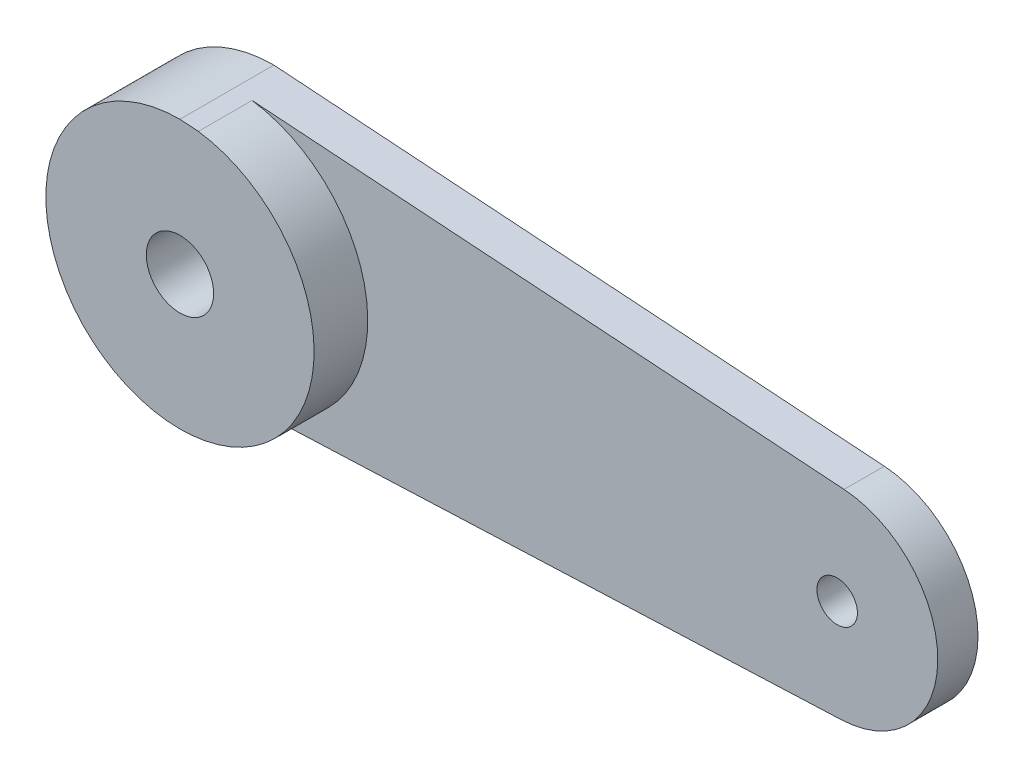
ISO-10303-21;
HEADER;
FILE_DESCRIPTION(('STEP AP214'),'2;1');
FILE_NAME('part.step','',(''),(''),'','','');
FILE_SCHEMA(('AUTOMOTIVE_DESIGN { 1 0 10303 214 1 1 1 1 }'));
ENDSEC;
DATA;
#1=APPLICATION_CONTEXT('core data for automotive mechanical design processes');
#2=APPLICATION_PROTOCOL_DEFINITION('international standard','automotive_design',2000,#1);
#3=PRODUCT_CONTEXT('',#1,'mechanical');
#4=PRODUCT('Part','Part','',(#3));
#5=PRODUCT_RELATED_PRODUCT_CATEGORY('part','',(#4));
#6=PRODUCT_DEFINITION_FORMATION('','',#4);
#7=PRODUCT_DEFINITION_CONTEXT('part definition',#1,'design');
#8=PRODUCT_DEFINITION('design','',#6,#7);
#9=PRODUCT_DEFINITION_SHAPE('','',#8);
#10=(LENGTH_UNIT() NAMED_UNIT(*) SI_UNIT(.MILLI.,.METRE.));
#11=(NAMED_UNIT(*) PLANE_ANGLE_UNIT() SI_UNIT($,.RADIAN.));
#12=(NAMED_UNIT(*) SI_UNIT($,.STERADIAN.) SOLID_ANGLE_UNIT());
#13=UNCERTAINTY_MEASURE_WITH_UNIT(LENGTH_MEASURE(1.E-05),#10,'distance_accuracy_value','');
#14=(GEOMETRIC_REPRESENTATION_CONTEXT(3) GLOBAL_UNCERTAINTY_ASSIGNED_CONTEXT((#13)) GLOBAL_UNIT_ASSIGNED_CONTEXT((#10,
#11,#12)) REPRESENTATION_CONTEXT('',''));
#15=CARTESIAN_POINT('',(0.,0.,0.));
#16=DIRECTION('',(0.,0.,1.));
#17=DIRECTION('',(1.,0.,0.));
#18=AXIS2_PLACEMENT_3D('',#15,#16,#17);
#19=CARTESIAN_POINT('',(0.686952853013244,9.95258475724918,7.));
#20=DIRECTION('',(0.0688587269348014,0.997626420923643,0.));
#21=DIRECTION('',(-0.997626420923644,0.0688587269348014,0.));
#22=AXIS2_PLACEMENT_3D('',#19,#20,#21);
#23=PLANE('',#22);
#24=DIRECTION('',(0.997626420923644,-0.0688587269348014,0.));
#25=VECTOR('',#24,1.);
#26=CARTESIAN_POINT('',(0.686952853013244,9.95258475724918,0.));
#27=LINE('',#26,#25);
#28=CARTESIAN_POINT('',(0.,10.,0.));
#29=VERTEX_POINT('',#28);
#30=CARTESIAN_POINT('',(45.5121199289753,6.85863708830833,0.));
#31=VERTEX_POINT('',#30);
#32=EDGE_CURVE('E115',#29,#31,#27,.T.);
#33=ORIENTED_EDGE('',*,*,#32,.F.);
#34=DIRECTION('',(0.,0.,-1.));
#35=VECTOR('',#34,1.);
#36=CARTESIAN_POINT('',(0.,10.,7.));
#37=LINE('',#36,#35);
#38=CARTESIAN_POINT('',(0.,10.,7.));
#39=VERTEX_POINT('',#38);
#40=EDGE_CURVE('E11',#39,#29,#37,.T.);
#41=ORIENTED_EDGE('',*,*,#40,.F.);
#42=DIRECTION('',(0.997626420923644,-0.0688587269348014,0.));
#43=VECTOR('',#42,1.);
#44=CARTESIAN_POINT('',(0.686952853013244,9.95258475724918,7.));
#45=LINE('',#44,#43);
#46=CARTESIAN_POINT('',(1.37390570602649,9.90516951449837,7.));
#47=VERTEX_POINT('',#46);
#48=EDGE_CURVE('E124',#39,#47,#45,.T.);
#49=ORIENTED_EDGE('',*,*,#48,.T.);
#50=DIRECTION('',(0.,0.,-1.));
#51=VECTOR('',#50,1.);
#52=CARTESIAN_POINT('',(1.37390570602649,9.90516951449837,7.));
#53=LINE('',#52,#51);
#54=CARTESIAN_POINT('',(1.37390570602649,9.90516951449837,3.));
#55=VERTEX_POINT('',#54);
#56=EDGE_CURVE('E139',#47,#55,#53,.T.);
#57=ORIENTED_EDGE('',*,*,#56,.T.);
#58=DIRECTION('',(0.997626420923644,-0.0688587269348014,0.));
#59=VECTOR('',#58,1.);
#60=CARTESIAN_POINT('',(0.686952853013244,9.95258475724918,3.));
#61=LINE('',#60,#59);
#62=CARTESIAN_POINT('',(45.5121199289753,6.85863708830833,3.));
#63=VERTEX_POINT('',#62);
#64=EDGE_CURVE('E100',#55,#63,#61,.T.);
#65=ORIENTED_EDGE('',*,*,#64,.T.);
#66=DIRECTION('',(0.,0.,-1.));
#67=VECTOR('',#66,1.);
#68=CARTESIAN_POINT('',(45.5121199289753,6.85863708830833,3.));
#69=LINE('',#68,#67);
#70=EDGE_CURVE('E96',#63,#31,#69,.T.);
#71=ORIENTED_EDGE('',*,*,#70,.T.);
#72=EDGE_LOOP('',(#33,#41,#49,#57,#65,#71));
#73=FACE_BOUND('',#72,.T.);
#74=ADVANCED_FACE('F37',(#73),#23,.T.);
#75=CARTESIAN_POINT('',(0.,0.,7.));
#76=DIRECTION('',(0.,0.,-1.));
#77=DIRECTION('',(-1.,0.,0.));
#78=AXIS2_PLACEMENT_3D('',#75,#76,#77);
#79=CYLINDRICAL_SURFACE('',#78,10.);
#80=CARTESIAN_POINT('',(0.,0.,0.));
#81=DIRECTION('',(0.,0.,1.));
#82=DIRECTION('',(1.,0.,0.));
#83=AXIS2_PLACEMENT_3D('',#80,#81,#82);
#84=CIRCLE('',#83,10.);
#85=CARTESIAN_POINT('',(0.,-10.,0.));
#86=VERTEX_POINT('',#85);
#87=EDGE_CURVE('E135',#29,#86,#84,.T.);
#88=ORIENTED_EDGE('',*,*,#87,.T.);
#89=DIRECTION('',(0.,0.,-1.));
#90=VECTOR('',#89,1.);
#91=CARTESIAN_POINT('',(0.,-10.,7.));
#92=LINE('',#91,#90);
#93=CARTESIAN_POINT('',(0.,-10.,7.));
#94=VERTEX_POINT('',#93);
#95=EDGE_CURVE('E45',#94,#86,#92,.T.);
#96=ORIENTED_EDGE('',*,*,#95,.F.);
#97=CARTESIAN_POINT('',(0.,0.,7.));
#98=DIRECTION('',(0.,0.,1.));
#99=DIRECTION('',(1.,0.,0.));
#100=AXIS2_PLACEMENT_3D('',#97,#98,#99);
#101=CIRCLE('',#100,10.);
#102=EDGE_CURVE('E127',#39,#94,#101,.T.);
#103=ORIENTED_EDGE('',*,*,#102,.F.);
#104=ORIENTED_EDGE('',*,*,#40,.T.);
#105=EDGE_LOOP('',(#88,#96,#103,#104));
#106=FACE_BOUND('',#105,.T.);
#107=ADVANCED_FACE('F145',(#106),#79,.T.);
#108=CARTESIAN_POINT('',(0.414871138524848,-9.98275846679519,7.));
#109=DIRECTION('',(-0.041522925239939,0.999137551430992,0.));
#110=DIRECTION('',(-0.999137551430992,-0.041522925239939,0.));
#111=AXIS2_PLACEMENT_3D('',#108,#109,#110);
#112=PLANE('',#111);
#113=DIRECTION('',(0.999137551430992,0.041522925239939,0.));
#114=VECTOR('',#113,1.);
#115=CARTESIAN_POINT('',(0.414871138524848,-9.98275846679519,0.));
#116=LINE('',#115,#114);
#117=CARTESIAN_POINT('',(45.3071014162638,-8.11709270435144,0.));
#118=VERTEX_POINT('',#117);
#119=EDGE_CURVE('E110',#86,#118,#116,.T.);
#120=ORIENTED_EDGE('',*,*,#119,.T.);
#121=DIRECTION('',(0.,0.,-1.));
#122=VECTOR('',#121,1.);
#123=CARTESIAN_POINT('',(45.3071014162638,-8.11709270435144,3.));
#124=LINE('',#123,#122);
#125=CARTESIAN_POINT('',(45.3071014162638,-8.11709270435144,3.));
#126=VERTEX_POINT('',#125);
#127=EDGE_CURVE('E94',#126,#118,#124,.T.);
#128=ORIENTED_EDGE('',*,*,#127,.F.);
#129=DIRECTION('',(0.999137551430992,0.041522925239939,0.));
#130=VECTOR('',#129,1.);
#131=CARTESIAN_POINT('',(0.414871138524848,-9.98275846679519,3.));
#132=LINE('',#131,#130);
#133=CARTESIAN_POINT('',(0.829742277049664,-9.96551693359037,3.));
#134=VERTEX_POINT('',#133);
#135=EDGE_CURVE('E101',#134,#126,#132,.T.);
#136=ORIENTED_EDGE('',*,*,#135,.F.);
#137=DIRECTION('',(0.,0.,-1.));
#138=VECTOR('',#137,1.);
#139=CARTESIAN_POINT('',(0.829742277049664,-9.96551693359037,7.));
#140=LINE('',#139,#138);
#141=CARTESIAN_POINT('',(0.829742277049664,-9.96551693359037,7.));
#142=VERTEX_POINT('',#141);
#143=EDGE_CURVE('E52',#142,#134,#140,.T.);
#144=ORIENTED_EDGE('',*,*,#143,.F.);
#145=DIRECTION('',(0.999137551430992,0.041522925239939,0.));
#146=VECTOR('',#145,1.);
#147=CARTESIAN_POINT('',(0.414871138524848,-9.98275846679519,7.));
#148=LINE('',#147,#146);
#149=EDGE_CURVE('E130',#94,#142,#148,.T.);
#150=ORIENTED_EDGE('',*,*,#149,.F.);
#151=ORIENTED_EDGE('',*,*,#95,.T.);
#152=EDGE_LOOP('',(#120,#128,#136,#144,#150,#151));
#153=FACE_BOUND('',#152,.T.);
#154=ADVANCED_FACE('F108',(#153),#112,.F.);
#155=CARTESIAN_POINT('',(0.,0.,7.));
#156=DIRECTION('',(0.,0.,-1.));
#157=DIRECTION('',(-1.,0.,0.));
#158=AXIS2_PLACEMENT_3D('',#155,#156,#157);
#159=CYLINDRICAL_SURFACE('',#158,2.51);
#160=CARTESIAN_POINT('',(0.,0.,7.));
#161=DIRECTION('',(0.,0.,1.));
#162=DIRECTION('',(1.,0.,0.));
#163=AXIS2_PLACEMENT_3D('',#160,#161,#162);
#164=CIRCLE('',#163,2.51);
#165=CARTESIAN_POINT('',(2.51,0.,7.));
#166=VERTEX_POINT('',#165);
#167=EDGE_CURVE('E121',#166,#166,#164,.T.);
#168=ORIENTED_EDGE('',*,*,#167,.T.);
#169=EDGE_LOOP('',(#168));
#170=FACE_BOUND('',#169,.T.);
#171=CARTESIAN_POINT('',(0.,0.,0.));
#172=DIRECTION('',(0.,0.,1.));
#173=DIRECTION('',(1.,0.,0.));
#174=AXIS2_PLACEMENT_3D('',#171,#172,#173);
#175=CIRCLE('',#174,2.51);
#176=CARTESIAN_POINT('',(2.51,0.,0.));
#177=VERTEX_POINT('',#176);
#178=EDGE_CURVE('E112',#177,#177,#175,.T.);
#179=ORIENTED_EDGE('',*,*,#178,.F.);
#180=EDGE_LOOP('',(#179));
#181=FACE_BOUND('',#180,.T.);
#182=ADVANCED_FACE('F39',(#170,#181),#159,.F.);
#183=ORIENTED_EDGE('',*,*,#143,.T.);
#184=CARTESIAN_POINT('',(0.,0.,3.));
#185=DIRECTION('',(0.,0.,1.));
#186=DIRECTION('',(1.,0.,0.));
#187=AXIS2_PLACEMENT_3D('',#184,#185,#186);
#188=CIRCLE('',#187,10.);
#189=EDGE_CURVE('E57',#134,#55,#188,.T.);
#190=ORIENTED_EDGE('',*,*,#189,.T.);
#191=ORIENTED_EDGE('',*,*,#56,.F.);
#192=EDGE_CURVE('E131',#142,#47,#101,.T.);
#193=ORIENTED_EDGE('',*,*,#192,.F.);
#194=EDGE_LOOP('',(#183,#190,#191,#193));
#195=FACE_BOUND('',#194,.T.);
#196=ADVANCED_FACE('F173',(#195),#79,.T.);
#197=CARTESIAN_POINT('',(0.,0.,7.));
#198=DIRECTION('',(0.,0.,1.));
#199=DIRECTION('',(1.,0.,0.));
#200=AXIS2_PLACEMENT_3D('',#197,#198,#199);
#201=PLANE('',#200);
#202=ORIENTED_EDGE('',*,*,#167,.F.);
#203=EDGE_LOOP('',(#202));
#204=FACE_BOUND('',#203,.T.);
#205=ORIENTED_EDGE('',*,*,#48,.F.);
#206=ORIENTED_EDGE('',*,*,#102,.T.);
#207=ORIENTED_EDGE('',*,*,#149,.T.);
#208=ORIENTED_EDGE('',*,*,#192,.T.);
#209=EDGE_LOOP('',(#205,#206,#207,#208));
#210=FACE_BOUND('',#209,.T.);
#211=ADVANCED_FACE('F178',(#204,#210),#201,.T.);
#212=CARTESIAN_POINT('',(0.,0.,0.));
#213=DIRECTION('',(0.,0.,1.));
#214=DIRECTION('',(1.,0.,0.));
#215=AXIS2_PLACEMENT_3D('',#212,#213,#214);
#216=PLANE('',#215);
#217=ORIENTED_EDGE('',*,*,#178,.T.);
#218=EDGE_LOOP('',(#217));
#219=FACE_BOUND('',#218,.T.);
#220=ORIENTED_EDGE('',*,*,#32,.T.);
#221=CARTESIAN_POINT('',(44.9956794769643,-0.623561068618998,0.));
#222=DIRECTION('',(0.,0.,1.));
#223=DIRECTION('',(1.,0.,0.));
#224=AXIS2_PLACEMENT_3D('',#221,#222,#223);
#225=CIRCLE('',#224,7.5);
#226=EDGE_CURVE('E151',#118,#31,#225,.T.);
#227=ORIENTED_EDGE('',*,*,#226,.F.);
#228=ORIENTED_EDGE('',*,*,#119,.F.);
#229=ORIENTED_EDGE('',*,*,#87,.F.);
#230=EDGE_LOOP('',(#220,#227,#228,#229));
#231=FACE_BOUND('',#230,.T.);
#232=CARTESIAN_POINT('',(44.9956794769643,-0.623561068618998,0.));
#233=DIRECTION('',(0.,0.,1.));
#234=DIRECTION('',(1.,0.,0.));
#235=AXIS2_PLACEMENT_3D('',#232,#233,#234);
#236=CIRCLE('',#235,1.51);
#237=CARTESIAN_POINT('',(46.5056794769643,-0.623561068618998,0.));
#238=VERTEX_POINT('',#237);
#239=EDGE_CURVE('E106',#238,#238,#236,.T.);
#240=ORIENTED_EDGE('',*,*,#239,.T.);
#241=EDGE_LOOP('',(#240));
#242=FACE_BOUND('',#241,.T.);
#243=ADVANCED_FACE('F148',(#219,#231,#242),#216,.F.);
#244=CARTESIAN_POINT('',(44.9956794769643,-0.623561068618998,3.));
#245=DIRECTION('',(0.,0.,-1.));
#246=DIRECTION('',(-1.,0.,0.));
#247=AXIS2_PLACEMENT_3D('',#244,#245,#246);
#248=CYLINDRICAL_SURFACE('',#247,7.5);
#249=ORIENTED_EDGE('',*,*,#226,.T.);
#250=ORIENTED_EDGE('',*,*,#70,.F.);
#251=CARTESIAN_POINT('',(44.9956794769643,-0.623561068618998,3.));
#252=DIRECTION('',(0.,0.,1.));
#253=DIRECTION('',(1.,0.,0.));
#254=AXIS2_PLACEMENT_3D('',#251,#252,#253);
#255=CIRCLE('',#254,7.5);
#256=EDGE_CURVE('E89',#126,#63,#255,.T.);
#257=ORIENTED_EDGE('',*,*,#256,.F.);
#258=ORIENTED_EDGE('',*,*,#127,.T.);
#259=EDGE_LOOP('',(#249,#250,#257,#258));
#260=FACE_BOUND('',#259,.T.);
#261=ADVANCED_FACE('F92',(#260),#248,.T.);
#262=CARTESIAN_POINT('',(44.9956794769643,-0.623561068618998,3.));
#263=DIRECTION('',(0.,0.,-1.));
#264=DIRECTION('',(-1.,0.,0.));
#265=AXIS2_PLACEMENT_3D('',#262,#263,#264);
#266=CYLINDRICAL_SURFACE('',#265,1.51);
#267=CARTESIAN_POINT('',(44.9956794769643,-0.623561068618998,3.));
#268=DIRECTION('',(0.,0.,1.));
#269=DIRECTION('',(1.,0.,0.));
#270=AXIS2_PLACEMENT_3D('',#267,#268,#269);
#271=CIRCLE('',#270,1.51);
#272=CARTESIAN_POINT('',(46.5056794769643,-0.623561068618998,3.));
#273=VERTEX_POINT('',#272);
#274=EDGE_CURVE('E117',#273,#273,#271,.T.);
#275=ORIENTED_EDGE('',*,*,#274,.T.);
#276=EDGE_LOOP('',(#275));
#277=FACE_BOUND('',#276,.T.);
#278=ORIENTED_EDGE('',*,*,#239,.F.);
#279=EDGE_LOOP('',(#278));
#280=FACE_BOUND('',#279,.T.);
#281=ADVANCED_FACE('F160',(#277,#280),#266,.F.);
#282=CARTESIAN_POINT('',(0.,0.,3.));
#283=DIRECTION('',(0.,0.,1.));
#284=DIRECTION('',(1.,0.,0.));
#285=AXIS2_PLACEMENT_3D('',#282,#283,#284);
#286=PLANE('',#285);
#287=ORIENTED_EDGE('',*,*,#135,.T.);
#288=ORIENTED_EDGE('',*,*,#256,.T.);
#289=ORIENTED_EDGE('',*,*,#64,.F.);
#290=ORIENTED_EDGE('',*,*,#189,.F.);
#291=EDGE_LOOP('',(#287,#288,#289,#290));
#292=FACE_BOUND('',#291,.T.);
#293=ORIENTED_EDGE('',*,*,#274,.F.);
#294=EDGE_LOOP('',(#293));
#295=FACE_BOUND('',#294,.T.);
#296=ADVANCED_FACE('F103',(#292,#295),#286,.T.);
#297=CLOSED_SHELL('',(#74,#107,#154,#182,#196,#211,#243,#261,#281,#296));
#298=MANIFOLD_SOLID_BREP('B2',#297);
#299=ADVANCED_BREP_SHAPE_REPRESENTATION('',(#18,#298),#14);
#300=SHAPE_DEFINITION_REPRESENTATION(#9,#299);
ENDSEC;
END-ISO-10303-21;
